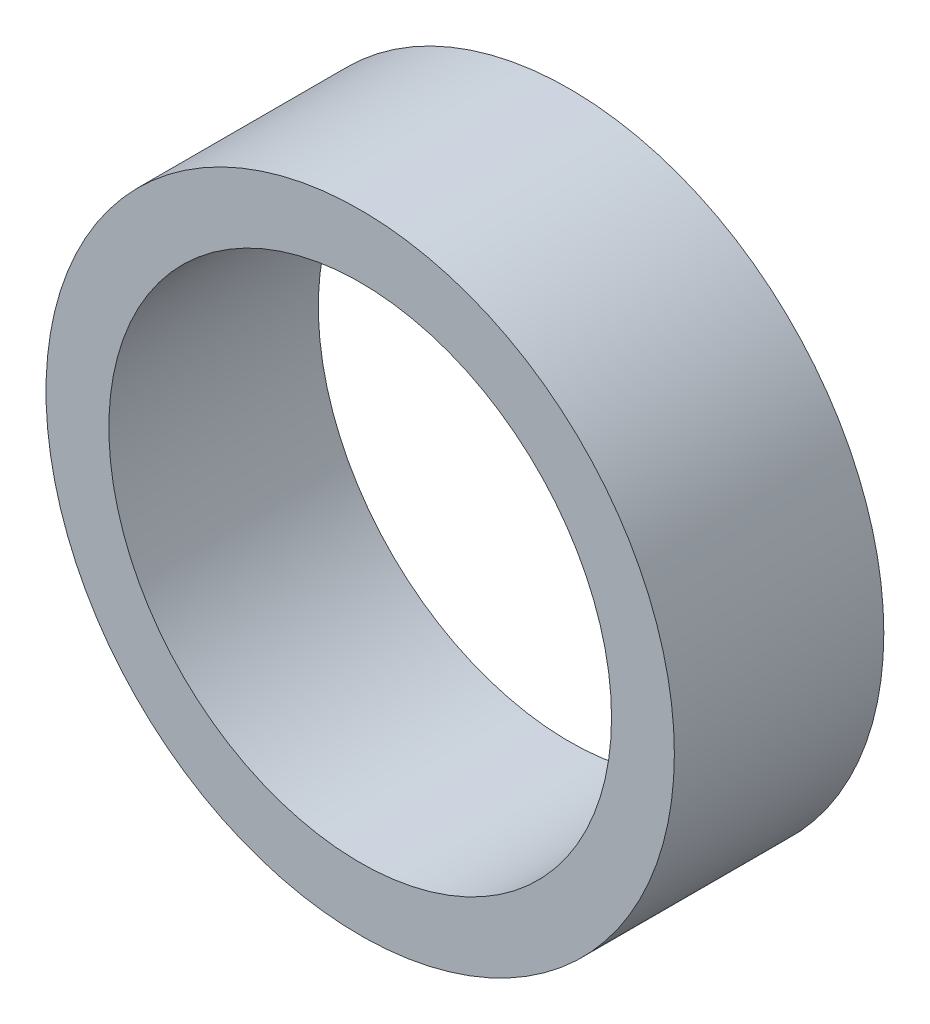
ISO-10303-21;
HEADER;
FILE_DESCRIPTION(('STEP AP214'),'2;1');
FILE_NAME('part.step','',(''),(''),'','','');
FILE_SCHEMA(('AUTOMOTIVE_DESIGN { 1 0 10303 214 1 1 1 1 }'));
ENDSEC;
DATA;
#1=APPLICATION_CONTEXT('core data for automotive mechanical design processes');
#2=APPLICATION_PROTOCOL_DEFINITION('international standard','automotive_design',2000,#1);
#3=PRODUCT_CONTEXT('',#1,'mechanical');
#4=PRODUCT('Part','Part','',(#3));
#5=PRODUCT_RELATED_PRODUCT_CATEGORY('part','',(#4));
#6=PRODUCT_DEFINITION_FORMATION('','',#4);
#7=PRODUCT_DEFINITION_CONTEXT('part definition',#1,'design');
#8=PRODUCT_DEFINITION('design','',#6,#7);
#9=PRODUCT_DEFINITION_SHAPE('','',#8);
#10=(LENGTH_UNIT() NAMED_UNIT(*) SI_UNIT(.MILLI.,.METRE.));
#11=(NAMED_UNIT(*) PLANE_ANGLE_UNIT() SI_UNIT($,.RADIAN.));
#12=(NAMED_UNIT(*) SI_UNIT($,.STERADIAN.) SOLID_ANGLE_UNIT());
#13=UNCERTAINTY_MEASURE_WITH_UNIT(LENGTH_MEASURE(1.E-05),#10,'distance_accuracy_value','');
#14=(GEOMETRIC_REPRESENTATION_CONTEXT(3) GLOBAL_UNCERTAINTY_ASSIGNED_CONTEXT((#13)) GLOBAL_UNIT_ASSIGNED_CONTEXT((#10,
#11,#12)) REPRESENTATION_CONTEXT('',''));
#15=CARTESIAN_POINT('',(0.,0.,0.));
#16=DIRECTION('',(0.,0.,1.));
#17=DIRECTION('',(1.,0.,0.));
#18=AXIS2_PLACEMENT_3D('',#15,#16,#17);
#19=CARTESIAN_POINT('',(0.,0.,5.));
#20=DIRECTION('',(0.,0.,1.));
#21=DIRECTION('',(1.,0.,0.));
#22=AXIS2_PLACEMENT_3D('',#19,#20,#21);
#23=PLANE('',#22);
#24=CARTESIAN_POINT('',(0.,0.,5.));
#25=DIRECTION('',(0.,0.,1.));
#26=DIRECTION('',(1.,0.,0.));
#27=AXIS2_PLACEMENT_3D('',#24,#25,#26);
#28=CIRCLE('',#27,7.5);
#29=CARTESIAN_POINT('',(7.5,0.,5.));
#30=VERTEX_POINT('',#29);
#31=EDGE_CURVE('E10',#30,#30,#28,.T.);
#32=ORIENTED_EDGE('',*,*,#31,.T.);
#33=EDGE_LOOP('',(#32));
#34=FACE_BOUND('',#33,.T.);
#35=CARTESIAN_POINT('',(0.,0.,5.));
#36=DIRECTION('',(0.,0.,1.));
#37=DIRECTION('',(1.,0.,0.));
#38=AXIS2_PLACEMENT_3D('',#35,#36,#37);
#39=CIRCLE('',#38,6.);
#40=CARTESIAN_POINT('',(6.,0.,5.));
#41=VERTEX_POINT('',#40);
#42=EDGE_CURVE('E42',#41,#41,#39,.T.);
#43=ORIENTED_EDGE('',*,*,#42,.F.);
#44=EDGE_LOOP('',(#43));
#45=FACE_BOUND('',#44,.T.);
#46=ADVANCED_FACE('F31',(#34,#45),#23,.T.);
#47=CARTESIAN_POINT('',(0.,0.,0.));
#48=DIRECTION('',(0.,0.,1.));
#49=DIRECTION('',(1.,0.,0.));
#50=AXIS2_PLACEMENT_3D('',#47,#48,#49);
#51=PLANE('',#50);
#52=CARTESIAN_POINT('',(0.,0.,0.));
#53=DIRECTION('',(0.,0.,1.));
#54=DIRECTION('',(1.,0.,0.));
#55=AXIS2_PLACEMENT_3D('',#52,#53,#54);
#56=CIRCLE('',#55,7.5);
#57=CARTESIAN_POINT('',(7.5,0.,0.));
#58=VERTEX_POINT('',#57);
#59=EDGE_CURVE('E35',#58,#58,#56,.T.);
#60=ORIENTED_EDGE('',*,*,#59,.F.);
#61=EDGE_LOOP('',(#60));
#62=FACE_BOUND('',#61,.T.);
#63=CARTESIAN_POINT('',(0.,0.,0.));
#64=DIRECTION('',(0.,0.,1.));
#65=DIRECTION('',(1.,0.,0.));
#66=AXIS2_PLACEMENT_3D('',#63,#64,#65);
#67=CIRCLE('',#66,6.);
#68=CARTESIAN_POINT('',(6.,0.,0.));
#69=VERTEX_POINT('',#68);
#70=EDGE_CURVE('E44',#69,#69,#67,.T.);
#71=ORIENTED_EDGE('',*,*,#70,.T.);
#72=EDGE_LOOP('',(#71));
#73=FACE_BOUND('',#72,.T.);
#74=ADVANCED_FACE('F54',(#62,#73),#51,.F.);
#75=CARTESIAN_POINT('',(0.,0.,5.));
#76=DIRECTION('',(0.,0.,-1.));
#77=DIRECTION('',(-1.,0.,0.));
#78=AXIS2_PLACEMENT_3D('',#75,#76,#77);
#79=CYLINDRICAL_SURFACE('',#78,7.5);
#80=ORIENTED_EDGE('',*,*,#31,.F.);
#81=EDGE_LOOP('',(#80));
#82=FACE_BOUND('',#81,.T.);
#83=ORIENTED_EDGE('',*,*,#59,.T.);
#84=EDGE_LOOP('',(#83));
#85=FACE_BOUND('',#84,.T.);
#86=ADVANCED_FACE('F33',(#82,#85),#79,.T.);
#87=CARTESIAN_POINT('',(0.,0.,5.));
#88=DIRECTION('',(0.,0.,-1.));
#89=DIRECTION('',(-1.,0.,0.));
#90=AXIS2_PLACEMENT_3D('',#87,#88,#89);
#91=CYLINDRICAL_SURFACE('',#90,6.);
#92=ORIENTED_EDGE('',*,*,#42,.T.);
#93=EDGE_LOOP('',(#92));
#94=FACE_BOUND('',#93,.T.);
#95=ORIENTED_EDGE('',*,*,#70,.F.);
#96=EDGE_LOOP('',(#95));
#97=FACE_BOUND('',#96,.T.);
#98=ADVANCED_FACE('F50',(#94,#97),#91,.F.);
#99=CLOSED_SHELL('',(#46,#74,#86,#98));
#100=MANIFOLD_SOLID_BREP('B2',#99);
#101=ADVANCED_BREP_SHAPE_REPRESENTATION('',(#18,#100),#14);
#102=SHAPE_DEFINITION_REPRESENTATION(#9,#101);
ENDSEC;
END-ISO-10303-21;
